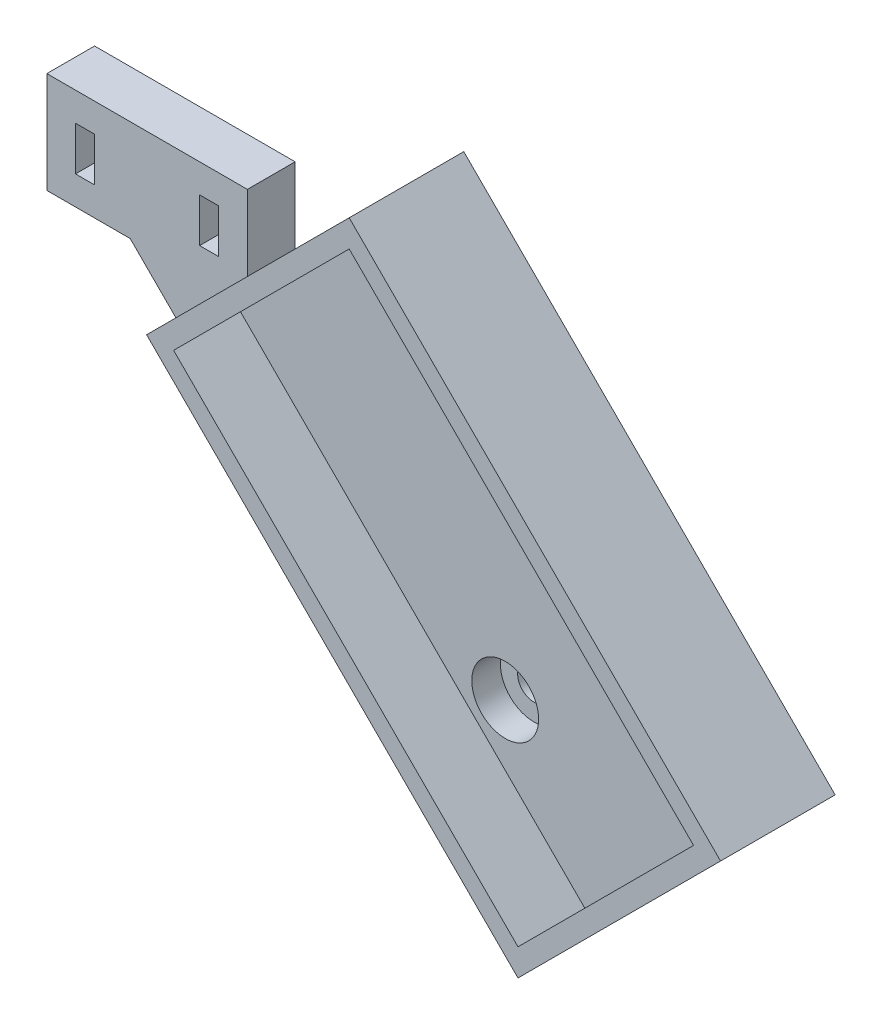
ISO-10303-21;
HEADER;
FILE_DESCRIPTION(('STEP AP214'),'2;1');
FILE_NAME('part.step','',(''),(''),'','','');
FILE_SCHEMA(('AUTOMOTIVE_DESIGN { 1 0 10303 214 1 1 1 1 }'));
ENDSEC;
DATA;
#1=APPLICATION_CONTEXT('core data for automotive mechanical design processes');
#2=APPLICATION_PROTOCOL_DEFINITION('international standard','automotive_design',2000,#1);
#3=PRODUCT_CONTEXT('',#1,'mechanical');
#4=PRODUCT('Part','Part','',(#3));
#5=PRODUCT_RELATED_PRODUCT_CATEGORY('part','',(#4));
#6=PRODUCT_DEFINITION_FORMATION('','',#4);
#7=PRODUCT_DEFINITION_CONTEXT('part definition',#1,'design');
#8=PRODUCT_DEFINITION('design','',#6,#7);
#9=PRODUCT_DEFINITION_SHAPE('','',#8);
#10=(LENGTH_UNIT() NAMED_UNIT(*) SI_UNIT(.MILLI.,.METRE.));
#11=(NAMED_UNIT(*) PLANE_ANGLE_UNIT() SI_UNIT($,.RADIAN.));
#12=(NAMED_UNIT(*) SI_UNIT($,.STERADIAN.) SOLID_ANGLE_UNIT());
#13=UNCERTAINTY_MEASURE_WITH_UNIT(LENGTH_MEASURE(1.E-05),#10,'distance_accuracy_value','');
#14=(GEOMETRIC_REPRESENTATION_CONTEXT(3) GLOBAL_UNCERTAINTY_ASSIGNED_CONTEXT((#13)) GLOBAL_UNIT_ASSIGNED_CONTEXT((#10,
#11,#12)) REPRESENTATION_CONTEXT('',''));
#15=CARTESIAN_POINT('',(0.,0.,0.));
#16=DIRECTION('',(0.,0.,1.));
#17=DIRECTION('',(1.,0.,0.));
#18=AXIS2_PLACEMENT_3D('',#15,#16,#17);
#19=CARTESIAN_POINT('',(-67.5,-52.5,102.));
#20=DIRECTION('',(0.,0.,1.));
#21=DIRECTION('',(-0.707106781186548,0.707106781186548,0.));
#22=AXIS2_PLACEMENT_3D('',#19,#20,#21);
#23=CYLINDRICAL_SURFACE('',#22,3.5);
#24=DIRECTION('',(0.,0.,1.));
#25=VECTOR('',#24,1.);
#26=CARTESIAN_POINT('',(-69.97487373415,-50.02512626584,102.));
#27=LINE('',#26,#25);
#28=CARTESIAN_POINT('',(-69.97487373415,-50.02512626584,102.));
#29=VERTEX_POINT('',#28);
#30=CARTESIAN_POINT('',(-69.97487373415,-50.02512626584,105.));
#31=VERTEX_POINT('',#30);
#32=EDGE_CURVE('E10',#29,#31,#27,.T.);
#33=ORIENTED_EDGE('',*,*,#32,.F.);
#34=CARTESIAN_POINT('',(-67.5,-52.5,102.));
#35=DIRECTION('',(0.,0.,1.));
#36=DIRECTION('',(-0.707106781186548,0.707106781186548,0.));
#37=AXIS2_PLACEMENT_3D('',#34,#35,#36);
#38=CIRCLE('',#37,3.5);
#39=EDGE_CURVE('E19',#29,#29,#38,.T.);
#40=ORIENTED_EDGE('',*,*,#39,.F.);
#41=ORIENTED_EDGE('',*,*,#32,.T.);
#42=CARTESIAN_POINT('',(-67.5,-52.5,105.));
#43=DIRECTION('',(0.,0.,1.));
#44=DIRECTION('',(-0.707106781186548,0.707106781186548,0.));
#45=AXIS2_PLACEMENT_3D('',#42,#43,#44);
#46=CIRCLE('',#45,3.5);
#47=EDGE_CURVE('E26',#31,#31,#46,.T.);
#48=ORIENTED_EDGE('',*,*,#47,.T.);
#49=EDGE_LOOP('',(#33,#40,#41,#48));
#50=FACE_BOUND('',#49,.T.);
#51=ADVANCED_FACE('F15',(#50),#23,.F.);
#52=CARTESIAN_POINT('',(-37.94796179957,-48.83883476483,105.));
#53=DIRECTION('',(0.,0.,1.));
#54=DIRECTION('',(1.,0.,0.));
#55=AXIS2_PLACEMENT_3D('',#52,#53,#54);
#56=PLANE('',#55);
#57=ORIENTED_EDGE('',*,*,#47,.F.);
#58=EDGE_LOOP('',(#57));
#59=FACE_BOUND('',#58,.T.);
#60=DIRECTION('',(0.707106781186548,-0.707106781186548,0.));
#61=VECTOR('',#60,1.);
#62=CARTESIAN_POINT('',(-40.06928214313,-49.54594154601,105.));
#63=LINE('',#62,#61);
#64=CARTESIAN_POINT('',(-76.83883476483,-12.77638892431,105.));
#65=VERTEX_POINT('',#64);
#66=CARTESIAN_POINT('',(-40.77638892431,-48.83883476483,105.));
#67=VERTEX_POINT('',#66);
#68=EDGE_CURVE('E369',#65,#67,#63,.T.);
#69=ORIENTED_EDGE('',*,*,#68,.F.);
#70=DIRECTION('',(-0.707106781186548,-0.707106781186548,0.));
#71=VECTOR('',#70,1.);
#72=CARTESIAN_POINT('',(-76.13172798364,-12.06928214313,105.));
#73=LINE('',#72,#71);
#74=CARTESIAN_POINT('',(-95.22361107568,-31.16116523516,105.));
#75=VERTEX_POINT('',#74);
#76=EDGE_CURVE('E359',#65,#75,#73,.T.);
#77=ORIENTED_EDGE('',*,*,#76,.T.);
#78=DIRECTION('',(0.707106781186548,-0.707106781186548,0.));
#79=VECTOR('',#78,1.);
#80=CARTESIAN_POINT('',(-58.45405845398,-67.93071785686,105.));
#81=LINE('',#80,#79);
#82=CARTESIAN_POINT('',(-59.16116523516,-67.22361107568,105.));
#83=VERTEX_POINT('',#82);
#84=EDGE_CURVE('E387',#75,#83,#81,.T.);
#85=ORIENTED_EDGE('',*,*,#84,.T.);
#86=DIRECTION('',(-0.707106781186548,-0.707106781186548,0.));
#87=VECTOR('',#86,1.);
#88=CARTESIAN_POINT('',(-40.06928214313,-48.13172798364,105.));
#89=LINE('',#88,#87);
#90=EDGE_CURVE('E382',#67,#83,#89,.T.);
#91=ORIENTED_EDGE('',*,*,#90,.F.);
#92=EDGE_LOOP('',(#69,#77,#85,#91));
#93=FACE_BOUND('',#92,.T.);
#94=ADVANCED_FACE('F510',(#59,#93),#56,.T.);
#95=CARTESIAN_POINT('',(-97.5,-27.3,99.9));
#96=DIRECTION('',(0.,-1.,0.));
#97=DIRECTION('',(0.,0.,-1.));
#98=AXIS2_PLACEMENT_3D('',#95,#96,#97);
#99=PLANE('',#98);
#100=DIRECTION('',(1.,0.,0.));
#101=VECTOR('',#100,1.);
#102=CARTESIAN_POINT('',(-96.,-27.3,105.));
#103=LINE('',#102,#101);
#104=CARTESIAN_POINT('',(-99.5,-27.3,105.));
#105=VERTEX_POINT('',#104);
#106=CARTESIAN_POINT('',(-97.5,-27.3,105.));
#107=VERTEX_POINT('',#106);
#108=EDGE_CURVE('E392',#105,#107,#103,.T.);
#109=ORIENTED_EDGE('',*,*,#108,.T.);
#110=DIRECTION('',(0.,0.,1.));
#111=VECTOR('',#110,1.);
#112=CARTESIAN_POINT('',(-97.5,-27.3,99.9));
#113=LINE('',#112,#111);
#114=CARTESIAN_POINT('',(-97.5,-27.3,100.));
#115=VERTEX_POINT('',#114);
#116=EDGE_CURVE('E280',#115,#107,#113,.T.);
#117=ORIENTED_EDGE('',*,*,#116,.F.);
#118=DIRECTION('',(1.,0.,0.));
#119=VECTOR('',#118,1.);
#120=CARTESIAN_POINT('',(-96.,-27.3,100.));
#121=LINE('',#120,#119);
#122=CARTESIAN_POINT('',(-99.5,-27.3,100.));
#123=VERTEX_POINT('',#122);
#124=EDGE_CURVE('E438',#123,#115,#121,.T.);
#125=ORIENTED_EDGE('',*,*,#124,.F.);
#126=DIRECTION('',(0.,0.,1.));
#127=VECTOR('',#126,1.);
#128=CARTESIAN_POINT('',(-99.5,-27.3,99.9));
#129=LINE('',#128,#127);
#130=EDGE_CURVE('E354',#123,#105,#129,.T.);
#131=ORIENTED_EDGE('',*,*,#130,.T.);
#132=EDGE_LOOP('',(#109,#117,#125,#131));
#133=FACE_BOUND('',#132,.T.);
#134=ADVANCED_FACE('F515',(#133),#99,.F.);
#135=CARTESIAN_POINT('',(-97.5,-22.7,99.9));
#136=DIRECTION('',(-1.,0.,0.));
#137=DIRECTION('',(0.,1.,0.));
#138=AXIS2_PLACEMENT_3D('',#135,#136,#137);
#139=PLANE('',#138);
#140=DIRECTION('',(0.,0.,1.));
#141=VECTOR('',#140,1.);
#142=CARTESIAN_POINT('',(-97.5,-22.7,99.9));
#143=LINE('',#142,#141);
#144=CARTESIAN_POINT('',(-97.5,-22.7,100.));
#145=VERTEX_POINT('',#144);
#146=CARTESIAN_POINT('',(-97.5,-22.7,105.));
#147=VERTEX_POINT('',#146);
#148=EDGE_CURVE('E262',#145,#147,#143,.T.);
#149=ORIENTED_EDGE('',*,*,#148,.F.);
#150=DIRECTION('',(0.,-1.,0.));
#151=VECTOR('',#150,1.);
#152=CARTESIAN_POINT('',(-97.5,-21.2,100.));
#153=LINE('',#152,#151);
#154=EDGE_CURVE('E277',#145,#115,#153,.T.);
#155=ORIENTED_EDGE('',*,*,#154,.T.);
#156=ORIENTED_EDGE('',*,*,#116,.T.);
#157=DIRECTION('',(0.,-1.,0.));
#158=VECTOR('',#157,1.);
#159=CARTESIAN_POINT('',(-97.5,-21.2,105.));
#160=LINE('',#159,#158);
#161=EDGE_CURVE('E402',#147,#107,#160,.T.);
#162=ORIENTED_EDGE('',*,*,#161,.F.);
#163=EDGE_LOOP('',(#149,#155,#156,#162));
#164=FACE_BOUND('',#163,.T.);
#165=ADVANCED_FACE('F627',(#164),#139,.T.);
#166=CARTESIAN_POINT('',(-99.5,-22.7,99.9));
#167=DIRECTION('',(-1.,0.,0.));
#168=DIRECTION('',(0.,1.,0.));
#169=AXIS2_PLACEMENT_3D('',#166,#167,#168);
#170=PLANE('',#169);
#171=DIRECTION('',(0.,-1.,0.));
#172=VECTOR('',#171,1.);
#173=CARTESIAN_POINT('',(-99.5,-21.2,105.));
#174=LINE('',#173,#172);
#175=CARTESIAN_POINT('',(-99.5,-22.7,105.));
#176=VERTEX_POINT('',#175);
#177=EDGE_CURVE('E388',#176,#105,#174,.T.);
#178=ORIENTED_EDGE('',*,*,#177,.T.);
#179=ORIENTED_EDGE('',*,*,#130,.F.);
#180=DIRECTION('',(0.,-1.,0.));
#181=VECTOR('',#180,1.);
#182=CARTESIAN_POINT('',(-99.5,-21.2,100.));
#183=LINE('',#182,#181);
#184=CARTESIAN_POINT('',(-99.5,-22.7,100.));
#185=VERTEX_POINT('',#184);
#186=EDGE_CURVE('E464',#185,#123,#183,.T.);
#187=ORIENTED_EDGE('',*,*,#186,.F.);
#188=DIRECTION('',(0.,0.,1.));
#189=VECTOR('',#188,1.);
#190=CARTESIAN_POINT('',(-99.5,-22.7,99.9));
#191=LINE('',#190,#189);
#192=EDGE_CURVE('E233',#185,#176,#191,.T.);
#193=ORIENTED_EDGE('',*,*,#192,.T.);
#194=EDGE_LOOP('',(#178,#179,#187,#193));
#195=FACE_BOUND('',#194,.T.);
#196=ADVANCED_FACE('F622',(#195),#170,.F.);
#197=CARTESIAN_POINT('',(-97.5,-22.7,99.9));
#198=DIRECTION('',(0.,-1.,0.));
#199=DIRECTION('',(0.,0.,-1.));
#200=AXIS2_PLACEMENT_3D('',#197,#198,#199);
#201=PLANE('',#200);
#202=ORIENTED_EDGE('',*,*,#192,.F.);
#203=DIRECTION('',(1.,0.,0.));
#204=VECTOR('',#203,1.);
#205=CARTESIAN_POINT('',(-96.,-22.7,100.));
#206=LINE('',#205,#204);
#207=EDGE_CURVE('E368',#185,#145,#206,.T.);
#208=ORIENTED_EDGE('',*,*,#207,.T.);
#209=ORIENTED_EDGE('',*,*,#148,.T.);
#210=DIRECTION('',(1.,0.,0.));
#211=VECTOR('',#210,1.);
#212=CARTESIAN_POINT('',(-96.,-22.7,105.));
#213=LINE('',#212,#211);
#214=EDGE_CURVE('E398',#176,#147,#213,.T.);
#215=ORIENTED_EDGE('',*,*,#214,.F.);
#216=EDGE_LOOP('',(#202,#208,#209,#215));
#217=FACE_BOUND('',#216,.T.);
#218=ADVANCED_FACE('F582',(#217),#201,.T.);
#219=CARTESIAN_POINT('',(-110.5,-27.3,99.9));
#220=DIRECTION('',(0.,-1.,0.));
#221=DIRECTION('',(0.,0.,-1.));
#222=AXIS2_PLACEMENT_3D('',#219,#220,#221);
#223=PLANE('',#222);
#224=DIRECTION('',(1.,0.,0.));
#225=VECTOR('',#224,1.);
#226=CARTESIAN_POINT('',(-102.5,-27.3,105.));
#227=LINE('',#226,#225);
#228=CARTESIAN_POINT('',(-112.5,-27.3,105.));
#229=VERTEX_POINT('',#228);
#230=CARTESIAN_POINT('',(-110.5,-27.3,105.));
#231=VERTEX_POINT('',#230);
#232=EDGE_CURVE('E237',#229,#231,#227,.T.);
#233=ORIENTED_EDGE('',*,*,#232,.T.);
#234=DIRECTION('',(0.,0.,1.));
#235=VECTOR('',#234,1.);
#236=CARTESIAN_POINT('',(-110.5,-27.3,99.9));
#237=LINE('',#236,#235);
#238=CARTESIAN_POINT('',(-110.5,-27.3,100.));
#239=VERTEX_POINT('',#238);
#240=EDGE_CURVE('E220',#239,#231,#237,.T.);
#241=ORIENTED_EDGE('',*,*,#240,.F.);
#242=DIRECTION('',(1.,0.,0.));
#243=VECTOR('',#242,1.);
#244=CARTESIAN_POINT('',(-102.5,-27.3,100.));
#245=LINE('',#244,#243);
#246=CARTESIAN_POINT('',(-112.5,-27.3,100.));
#247=VERTEX_POINT('',#246);
#248=EDGE_CURVE('E276',#247,#239,#245,.T.);
#249=ORIENTED_EDGE('',*,*,#248,.F.);
#250=DIRECTION('',(0.,0.,1.));
#251=VECTOR('',#250,1.);
#252=CARTESIAN_POINT('',(-112.5,-27.3,99.9));
#253=LINE('',#252,#251);
#254=EDGE_CURVE('E234',#247,#229,#253,.T.);
#255=ORIENTED_EDGE('',*,*,#254,.T.);
#256=EDGE_LOOP('',(#233,#241,#249,#255));
#257=FACE_BOUND('',#256,.T.);
#258=ADVANCED_FACE('F238',(#257),#223,.F.);
#259=CARTESIAN_POINT('',(-110.5,-22.7,99.9));
#260=DIRECTION('',(-1.,0.,0.));
#261=DIRECTION('',(0.,1.,0.));
#262=AXIS2_PLACEMENT_3D('',#259,#260,#261);
#263=PLANE('',#262);
#264=DIRECTION('',(0.,0.,1.));
#265=VECTOR('',#264,1.);
#266=CARTESIAN_POINT('',(-110.5,-22.7,99.9));
#267=LINE('',#266,#265);
#268=CARTESIAN_POINT('',(-110.5,-22.7,100.));
#269=VERTEX_POINT('',#268);
#270=CARTESIAN_POINT('',(-110.5,-22.7,105.));
#271=VERTEX_POINT('',#270);
#272=EDGE_CURVE('E270',#269,#271,#267,.T.);
#273=ORIENTED_EDGE('',*,*,#272,.F.);
#274=DIRECTION('',(0.,-1.,0.));
#275=VECTOR('',#274,1.);
#276=CARTESIAN_POINT('',(-110.5,-21.2,100.));
#277=LINE('',#276,#275);
#278=EDGE_CURVE('E228',#269,#239,#277,.T.);
#279=ORIENTED_EDGE('',*,*,#278,.T.);
#280=ORIENTED_EDGE('',*,*,#240,.T.);
#281=DIRECTION('',(0.,-1.,0.));
#282=VECTOR('',#281,1.);
#283=CARTESIAN_POINT('',(-110.5,-21.2,105.));
#284=LINE('',#283,#282);
#285=EDGE_CURVE('E225',#271,#231,#284,.T.);
#286=ORIENTED_EDGE('',*,*,#285,.F.);
#287=EDGE_LOOP('',(#273,#279,#280,#286));
#288=FACE_BOUND('',#287,.T.);
#289=ADVANCED_FACE('F223',(#288),#263,.T.);
#290=CARTESIAN_POINT('',(-112.5,-22.7,99.9));
#291=DIRECTION('',(-1.,0.,0.));
#292=DIRECTION('',(0.,1.,0.));
#293=AXIS2_PLACEMENT_3D('',#290,#291,#292);
#294=PLANE('',#293);
#295=DIRECTION('',(0.,-1.,0.));
#296=VECTOR('',#295,1.);
#297=CARTESIAN_POINT('',(-112.5,-21.2,105.));
#298=LINE('',#297,#296);
#299=CARTESIAN_POINT('',(-112.5,-22.7,105.));
#300=VERTEX_POINT('',#299);
#301=EDGE_CURVE('E243',#300,#229,#298,.T.);
#302=ORIENTED_EDGE('',*,*,#301,.T.);
#303=ORIENTED_EDGE('',*,*,#254,.F.);
#304=DIRECTION('',(0.,-1.,0.));
#305=VECTOR('',#304,1.);
#306=CARTESIAN_POINT('',(-112.5,-21.2,100.));
#307=LINE('',#306,#305);
#308=CARTESIAN_POINT('',(-112.5,-22.7,100.));
#309=VERTEX_POINT('',#308);
#310=EDGE_CURVE('E272',#309,#247,#307,.T.);
#311=ORIENTED_EDGE('',*,*,#310,.F.);
#312=DIRECTION('',(0.,0.,1.));
#313=VECTOR('',#312,1.);
#314=CARTESIAN_POINT('',(-112.5,-22.7,99.9));
#315=LINE('',#314,#313);
#316=EDGE_CURVE('E286',#309,#300,#315,.T.);
#317=ORIENTED_EDGE('',*,*,#316,.T.);
#318=EDGE_LOOP('',(#302,#303,#311,#317));
#319=FACE_BOUND('',#318,.T.);
#320=ADVANCED_FACE('F520',(#319),#294,.F.);
#321=CARTESIAN_POINT('',(-110.5,-22.7,99.9));
#322=DIRECTION('',(0.,-1.,0.));
#323=DIRECTION('',(0.,0.,-1.));
#324=AXIS2_PLACEMENT_3D('',#321,#322,#323);
#325=PLANE('',#324);
#326=ORIENTED_EDGE('',*,*,#316,.F.);
#327=DIRECTION('',(1.,0.,0.));
#328=VECTOR('',#327,1.);
#329=CARTESIAN_POINT('',(-102.5,-22.7,100.));
#330=LINE('',#329,#328);
#331=EDGE_CURVE('E268',#309,#269,#330,.T.);
#332=ORIENTED_EDGE('',*,*,#331,.T.);
#333=ORIENTED_EDGE('',*,*,#272,.T.);
#334=DIRECTION('',(1.,0.,0.));
#335=VECTOR('',#334,1.);
#336=CARTESIAN_POINT('',(-102.5,-22.7,105.));
#337=LINE('',#336,#335);
#338=EDGE_CURVE('E247',#300,#271,#337,.T.);
#339=ORIENTED_EDGE('',*,*,#338,.F.);
#340=EDGE_LOOP('',(#326,#332,#333,#339));
#341=FACE_BOUND('',#340,.T.);
#342=ADVANCED_FACE('F522',(#341),#325,.T.);
#343=CARTESIAN_POINT('',(-94.5,-19.7,100.));
#344=DIRECTION('',(0.,-1.,0.));
#345=DIRECTION('',(0.,0.,-1.));
#346=AXIS2_PLACEMENT_3D('',#343,#344,#345);
#347=PLANE('',#346);
#348=DIRECTION('',(0.,0.,1.));
#349=VECTOR('',#348,1.);
#350=CARTESIAN_POINT('',(-115.5,-19.7,100.));
#351=LINE('',#350,#349);
#352=CARTESIAN_POINT('',(-115.5,-19.7,100.));
#353=VERTEX_POINT('',#352);
#354=CARTESIAN_POINT('',(-115.5,-19.7,105.));
#355=VERTEX_POINT('',#354);
#356=EDGE_CURVE('E289',#353,#355,#351,.T.);
#357=ORIENTED_EDGE('',*,*,#356,.T.);
#358=DIRECTION('',(-1.,0.,0.));
#359=VECTOR('',#358,1.);
#360=CARTESIAN_POINT('',(-94.5,-19.7,105.));
#361=LINE('',#360,#359);
#362=CARTESIAN_POINT('',(-94.5,-19.7,105.));
#363=VERTEX_POINT('',#362);
#364=EDGE_CURVE('E299',#363,#355,#361,.T.);
#365=ORIENTED_EDGE('',*,*,#364,.F.);
#366=DIRECTION('',(0.,0.,1.));
#367=VECTOR('',#366,1.);
#368=CARTESIAN_POINT('',(-94.5,-19.7,100.));
#369=LINE('',#368,#367);
#370=CARTESIAN_POINT('',(-94.5,-19.7,100.));
#371=VERTEX_POINT('',#370);
#372=EDGE_CURVE('E386',#371,#363,#369,.T.);
#373=ORIENTED_EDGE('',*,*,#372,.F.);
#374=DIRECTION('',(-1.,0.,0.));
#375=VECTOR('',#374,1.);
#376=CARTESIAN_POINT('',(-94.5,-19.7,100.));
#377=LINE('',#376,#375);
#378=EDGE_CURVE('E295',#371,#353,#377,.T.);
#379=ORIENTED_EDGE('',*,*,#378,.T.);
#380=EDGE_LOOP('',(#357,#365,#373,#379));
#381=FACE_BOUND('',#380,.T.);
#382=ADVANCED_FACE('F698',(#381),#347,.F.);
#383=CARTESIAN_POINT('',(-115.5,-19.7,100.));
#384=DIRECTION('',(-1.,0.,0.));
#385=DIRECTION('',(0.,1.,0.));
#386=AXIS2_PLACEMENT_3D('',#383,#384,#385);
#387=PLANE('',#386);
#388=ORIENTED_EDGE('',*,*,#356,.F.);
#389=DIRECTION('',(0.,-1.,0.));
#390=VECTOR('',#389,1.);
#391=CARTESIAN_POINT('',(-115.5,-19.7,100.));
#392=LINE('',#391,#390);
#393=CARTESIAN_POINT('',(-115.5,-30.3,100.));
#394=VERTEX_POINT('',#393);
#395=EDGE_CURVE('E313',#353,#394,#392,.T.);
#396=ORIENTED_EDGE('',*,*,#395,.T.);
#397=DIRECTION('',(0.,0.,1.));
#398=VECTOR('',#397,1.);
#399=CARTESIAN_POINT('',(-115.5,-30.3,100.));
#400=LINE('',#399,#398);
#401=CARTESIAN_POINT('',(-115.5,-30.3,105.));
#402=VERTEX_POINT('',#401);
#403=EDGE_CURVE('E431',#394,#402,#400,.T.);
#404=ORIENTED_EDGE('',*,*,#403,.T.);
#405=DIRECTION('',(0.,-1.,0.));
#406=VECTOR('',#405,1.);
#407=CARTESIAN_POINT('',(-115.5,-19.7,105.));
#408=LINE('',#407,#406);
#409=EDGE_CURVE('E285',#355,#402,#408,.T.);
#410=ORIENTED_EDGE('',*,*,#409,.F.);
#411=EDGE_LOOP('',(#388,#396,#404,#410));
#412=FACE_BOUND('',#411,.T.);
#413=ADVANCED_FACE('F529',(#412),#387,.T.);
#414=CARTESIAN_POINT('',(-94.5,-30.3,100.));
#415=DIRECTION('',(0.,-1.,0.));
#416=DIRECTION('',(0.,0.,-1.));
#417=AXIS2_PLACEMENT_3D('',#414,#415,#416);
#418=PLANE('',#417);
#419=DIRECTION('',(-1.,0.,0.));
#420=VECTOR('',#419,1.);
#421=CARTESIAN_POINT('',(-94.5,-30.3,100.));
#422=LINE('',#421,#420);
#423=CARTESIAN_POINT('',(-106.7710678118,-30.3,100.));
#424=VERTEX_POINT('',#423);
#425=EDGE_CURVE('E445',#424,#394,#422,.T.);
#426=ORIENTED_EDGE('',*,*,#425,.F.);
#427=DIRECTION('',(0.,0.,-1.));
#428=VECTOR('',#427,1.);
#429=CARTESIAN_POINT('',(-106.7710678118,-30.3,100.));
#430=LINE('',#429,#428);
#431=CARTESIAN_POINT('',(-106.7710678118,-30.3,105.));
#432=VERTEX_POINT('',#431);
#433=EDGE_CURVE('E434',#432,#424,#430,.T.);
#434=ORIENTED_EDGE('',*,*,#433,.F.);
#435=DIRECTION('',(-1.,0.,0.));
#436=VECTOR('',#435,1.);
#437=CARTESIAN_POINT('',(-94.5,-30.3,105.));
#438=LINE('',#437,#436);
#439=EDGE_CURVE('E281',#432,#402,#438,.T.);
#440=ORIENTED_EDGE('',*,*,#439,.T.);
#441=ORIENTED_EDGE('',*,*,#403,.F.);
#442=EDGE_LOOP('',(#426,#434,#440,#441));
#443=FACE_BOUND('',#442,.T.);
#444=ADVANCED_FACE('F525',(#443),#418,.T.);
#445=CARTESIAN_POINT('',(-101.2738636073,-35.79720420448,100.));
#446=DIRECTION('',(-0.707106781186548,-0.707106781186548,0.));
#447=DIRECTION('',(-0.707106781186548,0.707106781186548,0.));
#448=AXIS2_PLACEMENT_3D('',#445,#446,#447);
#449=PLANE('',#448);
#450=DIRECTION('',(-0.707106781186548,0.707106781186548,0.));
#451=VECTOR('',#450,1.);
#452=CARTESIAN_POINT('',(-101.2738636073,-35.79720420448,100.));
#453=LINE('',#452,#451);
#454=CARTESIAN_POINT('',(-101.2738636073,-35.79720420448,100.));
#455=VERTEX_POINT('',#454);
#456=EDGE_CURVE('E358',#455,#424,#453,.T.);
#457=ORIENTED_EDGE('',*,*,#456,.F.);
#458=DIRECTION('',(0.,0.,1.));
#459=VECTOR('',#458,1.);
#460=CARTESIAN_POINT('',(-101.2738636073,-35.79720420448,100.));
#461=LINE('',#460,#459);
#462=CARTESIAN_POINT('',(-101.2738636073,-35.79720420448,105.));
#463=VERTEX_POINT('',#462);
#464=EDGE_CURVE('E349',#455,#463,#461,.T.);
#465=ORIENTED_EDGE('',*,*,#464,.T.);
#466=DIRECTION('',(-0.707106781186548,0.707106781186548,0.));
#467=VECTOR('',#466,1.);
#468=CARTESIAN_POINT('',(-101.2738636073,-35.79720420448,105.));
#469=LINE('',#468,#467);
#470=EDGE_CURVE('E254',#463,#432,#469,.T.);
#471=ORIENTED_EDGE('',*,*,#470,.T.);
#472=ORIENTED_EDGE('',*,*,#433,.T.);
#473=EDGE_LOOP('',(#457,#465,#471,#472));
#474=FACE_BOUND('',#473,.T.);
#475=ADVANCED_FACE('F528',(#474),#449,.T.);
#476=CARTESIAN_POINT('',(-67.5,-52.5,102.));
#477=DIRECTION('',(0.,0.,1.));
#478=DIRECTION('',(1.,0.,0.));
#479=AXIS2_PLACEMENT_3D('',#476,#477,#478);
#480=PLANE('',#479);
#481=CARTESIAN_POINT('',(-67.5,-52.5,102.));
#482=DIRECTION('',(0.,0.,1.));
#483=DIRECTION('',(-0.707106781186548,0.707106781186548,0.));
#484=AXIS2_PLACEMENT_3D('',#481,#482,#483);
#485=CIRCLE('',#484,1.7);
#486=CARTESIAN_POINT('',(-68.70208152801,-51.29791847198,102.));
#487=VERTEX_POINT('',#486);
#488=EDGE_CURVE('E347',#487,#487,#485,.T.);
#489=ORIENTED_EDGE('',*,*,#488,.F.);
#490=EDGE_LOOP('',(#489));
#491=FACE_BOUND('',#490,.T.);
#492=ORIENTED_EDGE('',*,*,#39,.T.);
#493=EDGE_LOOP('',(#492));
#494=FACE_BOUND('',#493,.T.);
#495=ADVANCED_FACE('F504',(#491,#494),#480,.T.);
#496=CARTESIAN_POINT('',(-94.5,-19.7,100.));
#497=DIRECTION('',(-1.,0.,0.));
#498=DIRECTION('',(0.,1.,0.));
#499=AXIS2_PLACEMENT_3D('',#496,#497,#498);
#500=PLANE('',#499);
#501=DIRECTION('',(0.,0.,1.));
#502=VECTOR('',#501,1.);
#503=CARTESIAN_POINT('',(-94.5,-27.60912703474,100.));
#504=LINE('',#503,#502);
#505=CARTESIAN_POINT('',(-94.5,-27.60912703474,100.));
#506=VERTEX_POINT('',#505);
#507=CARTESIAN_POINT('',(-94.5,-27.60912703474,105.));
#508=VERTEX_POINT('',#507);
#509=EDGE_CURVE('E342',#506,#508,#504,.T.);
#510=ORIENTED_EDGE('',*,*,#509,.F.);
#511=DIRECTION('',(0.,-1.,0.));
#512=VECTOR('',#511,1.);
#513=CARTESIAN_POINT('',(-94.5,-19.7,100.));
#514=LINE('',#513,#512);
#515=EDGE_CURVE('E290',#371,#506,#514,.T.);
#516=ORIENTED_EDGE('',*,*,#515,.F.);
#517=ORIENTED_EDGE('',*,*,#372,.T.);
#518=DIRECTION('',(0.,-1.,0.));
#519=VECTOR('',#518,1.);
#520=CARTESIAN_POINT('',(-94.5,-19.7,105.));
#521=LINE('',#520,#519);
#522=EDGE_CURVE('E296',#363,#508,#521,.T.);
#523=ORIENTED_EDGE('',*,*,#522,.T.);
#524=EDGE_LOOP('',(#510,#516,#517,#523));
#525=FACE_BOUND('',#524,.T.);
#526=ADVANCED_FACE('F494',(#525),#500,.F.);
#527=CARTESIAN_POINT('',(-40.77638892431,-48.83883476483,104.9));
#528=DIRECTION('',(-0.707106781186548,0.707106781186548,0.));
#529=DIRECTION('',(0.,0.,1.));
#530=AXIS2_PLACEMENT_3D('',#527,#528,#529);
#531=PLANE('',#530);
#532=DIRECTION('',(0.,0.,1.));
#533=VECTOR('',#532,1.);
#534=CARTESIAN_POINT('',(-40.77638892431,-48.83883476483,104.9));
#535=LINE('',#534,#533);
#536=CARTESIAN_POINT('',(-40.77638892431,-48.83883476483,112.));
#537=VERTEX_POINT('',#536);
#538=EDGE_CURVE('E373',#67,#537,#535,.T.);
#539=ORIENTED_EDGE('',*,*,#538,.F.);
#540=ORIENTED_EDGE('',*,*,#90,.T.);
#541=DIRECTION('',(0.,0.,1.));
#542=VECTOR('',#541,1.);
#543=CARTESIAN_POINT('',(-59.16116523516,-67.22361107568,104.9));
#544=LINE('',#543,#542);
#545=CARTESIAN_POINT('',(-59.16116523516,-67.22361107568,112.));
#546=VERTEX_POINT('',#545);
#547=EDGE_CURVE('E363',#83,#546,#544,.T.);
#548=ORIENTED_EDGE('',*,*,#547,.T.);
#549=DIRECTION('',(-0.707106781186548,-0.707106781186548,0.));
#550=VECTOR('',#549,1.);
#551=CARTESIAN_POINT('',(-40.06928214313,-48.13172798364,112.));
#552=LINE('',#551,#550);
#553=EDGE_CURVE('E326',#537,#546,#552,.T.);
#554=ORIENTED_EDGE('',*,*,#553,.F.);
#555=EDGE_LOOP('',(#539,#540,#548,#554));
#556=FACE_BOUND('',#555,.T.);
#557=ADVANCED_FACE('F491',(#556),#531,.T.);
#558=CARTESIAN_POINT('',(-59.16116523516,-67.22361107568,104.9));
#559=DIRECTION('',(-0.707106781186548,-0.707106781186548,0.));
#560=DIRECTION('',(-0.707106781186548,0.707106781186548,0.));
#561=AXIS2_PLACEMENT_3D('',#558,#559,#560);
#562=PLANE('',#561);
#563=DIRECTION('',(0.707106781186548,-0.707106781186548,0.));
#564=VECTOR('',#563,1.);
#565=CARTESIAN_POINT('',(-58.45405845398,-67.93071785686,112.));
#566=LINE('',#565,#564);
#567=CARTESIAN_POINT('',(-95.22361107568,-31.16116523516,112.));
#568=VERTEX_POINT('',#567);
#569=EDGE_CURVE('E321',#568,#546,#566,.T.);
#570=ORIENTED_EDGE('',*,*,#569,.T.);
#571=ORIENTED_EDGE('',*,*,#547,.F.);
#572=ORIENTED_EDGE('',*,*,#84,.F.);
#573=DIRECTION('',(0.,0.,1.));
#574=VECTOR('',#573,1.);
#575=CARTESIAN_POINT('',(-95.22361107568,-31.16116523516,104.9));
#576=LINE('',#575,#574);
#577=EDGE_CURVE('E364',#75,#568,#576,.T.);
#578=ORIENTED_EDGE('',*,*,#577,.T.);
#579=EDGE_LOOP('',(#570,#571,#572,#578));
#580=FACE_BOUND('',#579,.T.);
#581=ADVANCED_FACE('F493',(#580),#562,.F.);
#582=CARTESIAN_POINT('',(-76.83883476483,-12.77638892431,104.9));
#583=DIRECTION('',(-0.707106781186548,0.707106781186548,0.));
#584=DIRECTION('',(0.,0.,1.));
#585=AXIS2_PLACEMENT_3D('',#582,#583,#584);
#586=PLANE('',#585);
#587=DIRECTION('',(-0.707106781186548,-0.707106781186548,0.));
#588=VECTOR('',#587,1.);
#589=CARTESIAN_POINT('',(-76.13172798364,-12.06928214313,112.));
#590=LINE('',#589,#588);
#591=CARTESIAN_POINT('',(-76.83883476483,-12.77638892431,112.));
#592=VERTEX_POINT('',#591);
#593=EDGE_CURVE('E325',#592,#568,#590,.T.);
#594=ORIENTED_EDGE('',*,*,#593,.T.);
#595=ORIENTED_EDGE('',*,*,#577,.F.);
#596=ORIENTED_EDGE('',*,*,#76,.F.);
#597=DIRECTION('',(0.,0.,1.));
#598=VECTOR('',#597,1.);
#599=CARTESIAN_POINT('',(-76.83883476483,-12.77638892431,104.9));
#600=LINE('',#599,#598);
#601=EDGE_CURVE('E170',#65,#592,#600,.T.);
#602=ORIENTED_EDGE('',*,*,#601,.T.);
#603=EDGE_LOOP('',(#594,#595,#596,#602));
#604=FACE_BOUND('',#603,.T.);
#605=ADVANCED_FACE('F501',(#604),#586,.F.);
#606=CARTESIAN_POINT('',(-40.77638892431,-48.83883476483,104.9));
#607=DIRECTION('',(-0.707106781186548,-0.707106781186548,0.));
#608=DIRECTION('',(-0.707106781186548,0.707106781186548,0.));
#609=AXIS2_PLACEMENT_3D('',#606,#607,#608);
#610=PLANE('',#609);
#611=ORIENTED_EDGE('',*,*,#601,.F.);
#612=ORIENTED_EDGE('',*,*,#68,.T.);
#613=ORIENTED_EDGE('',*,*,#538,.T.);
#614=DIRECTION('',(0.707106781186548,-0.707106781186548,0.));
#615=VECTOR('',#614,1.);
#616=CARTESIAN_POINT('',(-40.06928214313,-49.54594154601,112.));
#617=LINE('',#616,#615);
#618=EDGE_CURVE('E258',#592,#537,#617,.T.);
#619=ORIENTED_EDGE('',*,*,#618,.F.);
#620=EDGE_LOOP('',(#611,#612,#613,#619));
#621=FACE_BOUND('',#620,.T.);
#622=ADVANCED_FACE('F486',(#621),#610,.T.);
#623=CARTESIAN_POINT('',(-94.5,-19.7,105.));
#624=DIRECTION('',(0.,0.,1.));
#625=DIRECTION('',(1.,0.,0.));
#626=AXIS2_PLACEMENT_3D('',#623,#624,#625);
#627=PLANE('',#626);
#628=ORIENTED_EDGE('',*,*,#214,.T.);
#629=ORIENTED_EDGE('',*,*,#161,.T.);
#630=ORIENTED_EDGE('',*,*,#108,.F.);
#631=ORIENTED_EDGE('',*,*,#177,.F.);
#632=EDGE_LOOP('',(#628,#629,#630,#631));
#633=FACE_BOUND('',#632,.T.);
#634=ORIENTED_EDGE('',*,*,#338,.T.);
#635=ORIENTED_EDGE('',*,*,#285,.T.);
#636=ORIENTED_EDGE('',*,*,#232,.F.);
#637=ORIENTED_EDGE('',*,*,#301,.F.);
#638=EDGE_LOOP('',(#634,#635,#636,#637));
#639=FACE_BOUND('',#638,.T.);
#640=ORIENTED_EDGE('',*,*,#522,.F.);
#641=ORIENTED_EDGE('',*,*,#364,.T.);
#642=ORIENTED_EDGE('',*,*,#409,.T.);
#643=ORIENTED_EDGE('',*,*,#439,.F.);
#644=ORIENTED_EDGE('',*,*,#470,.F.);
#645=DIRECTION('',(-0.707106781186548,-0.707106781186548,0.));
#646=VECTOR('',#645,1.);
#647=CARTESIAN_POINT('',(-94.20279579551,-28.72613639262,105.));
#648=LINE('',#647,#646);
#649=CARTESIAN_POINT('',(-97.34493141924,-31.86827201635,105.));
#650=VERTEX_POINT('',#649);
#651=EDGE_CURVE('E183',#650,#463,#648,.T.);
#652=ORIENTED_EDGE('',*,*,#651,.F.);
#653=DIRECTION('',(-0.707106781186548,0.707106781186548,0.));
#654=VECTOR('',#653,1.);
#655=CARTESIAN_POINT('',(-80.58388347648,-48.62931995911,105.));
#656=LINE('',#655,#654);
#657=CARTESIAN_POINT('',(-98.05203820042,-31.16116523516,105.));
#658=VERTEX_POINT('',#657);
#659=EDGE_CURVE('E338',#650,#658,#656,.T.);
#660=ORIENTED_EDGE('',*,*,#659,.T.);
#661=DIRECTION('',(0.707106781186548,0.707106781186548,0.));
#662=VECTOR('',#661,1.);
#663=CARTESIAN_POINT('',(-83.69213562373,-16.80126265847,105.));
#664=LINE('',#663,#662);
#665=EDGE_CURVE('E346',#658,#508,#664,.T.);
#666=ORIENTED_EDGE('',*,*,#665,.T.);
#667=EDGE_LOOP('',(#640,#641,#642,#643,#644,#652,#660,#666));
#668=FACE_BOUND('',#667,.T.);
#669=ADVANCED_FACE('F245',(#633,#639,#668),#627,.T.);
#670=CARTESIAN_POINT('',(-94.20279579551,-28.72613639262,100.));
#671=DIRECTION('',(-0.707106781186548,0.707106781186548,0.));
#672=DIRECTION('',(0.,0.,1.));
#673=AXIS2_PLACEMENT_3D('',#670,#671,#672);
#674=PLANE('',#673);
#675=ORIENTED_EDGE('',*,*,#464,.F.);
#676=DIRECTION('',(-0.707106781186548,-0.707106781186548,0.));
#677=VECTOR('',#676,1.);
#678=CARTESIAN_POINT('',(-94.20279579551,-28.72613639262,100.));
#679=LINE('',#678,#677);
#680=CARTESIAN_POINT('',(-97.34493141924,-31.86827201635,100.));
#681=VERTEX_POINT('',#680);
#682=EDGE_CURVE('E304',#681,#455,#679,.T.);
#683=ORIENTED_EDGE('',*,*,#682,.F.);
#684=DIRECTION('',(0.,0.,-1.));
#685=VECTOR('',#684,1.);
#686=CARTESIAN_POINT('',(-97.34493141924,-31.86827201635,100.));
#687=LINE('',#686,#685);
#688=EDGE_CURVE('E341',#650,#681,#687,.T.);
#689=ORIENTED_EDGE('',*,*,#688,.F.);
#690=ORIENTED_EDGE('',*,*,#651,.T.);
#691=EDGE_LOOP('',(#675,#683,#689,#690));
#692=FACE_BOUND('',#691,.T.);
#693=ADVANCED_FACE('F17',(#692),#674,.F.);
#694=CARTESIAN_POINT('',(-67.5,-52.5,99.9));
#695=DIRECTION('',(0.,0.,1.));
#696=DIRECTION('',(-0.707106781186548,0.707106781186548,0.));
#697=AXIS2_PLACEMENT_3D('',#694,#695,#696);
#698=CYLINDRICAL_SURFACE('',#697,1.7);
#699=DIRECTION('',(0.,0.,1.));
#700=VECTOR('',#699,1.);
#701=CARTESIAN_POINT('',(-68.70208152801,-51.29791847198,99.9));
#702=LINE('',#701,#700);
#703=CARTESIAN_POINT('',(-68.70208152801,-51.29791847198,100.));
#704=VERTEX_POINT('',#703);
#705=EDGE_CURVE('E350',#704,#487,#702,.T.);
#706=ORIENTED_EDGE('',*,*,#705,.F.);
#707=CARTESIAN_POINT('',(-67.5,-52.5,100.));
#708=DIRECTION('',(0.,0.,1.));
#709=DIRECTION('',(-0.707106781186548,0.707106781186548,0.));
#710=AXIS2_PLACEMENT_3D('',#707,#708,#709);
#711=CIRCLE('',#710,1.7);
#712=EDGE_CURVE('E337',#704,#704,#711,.T.);
#713=ORIENTED_EDGE('',*,*,#712,.F.);
#714=ORIENTED_EDGE('',*,*,#705,.T.);
#715=ORIENTED_EDGE('',*,*,#488,.T.);
#716=EDGE_LOOP('',(#706,#713,#714,#715));
#717=FACE_BOUND('',#716,.T.);
#718=ADVANCED_FACE('F558',(#717),#698,.F.);
#719=CARTESIAN_POINT('',(-76.83883476483,-9.947961799572,100.));
#720=DIRECTION('',(-0.707106781186548,0.707106781186548,0.));
#721=DIRECTION('',(0.,0.,1.));
#722=AXIS2_PLACEMENT_3D('',#719,#720,#721);
#723=PLANE('',#722);
#724=DIRECTION('',(0.,0.,1.));
#725=VECTOR('',#724,1.);
#726=CARTESIAN_POINT('',(-76.83883476483,-9.947961799572,100.));
#727=LINE('',#726,#725);
#728=CARTESIAN_POINT('',(-76.83883476483,-9.947961799572,100.));
#729=VERTEX_POINT('',#728);
#730=CARTESIAN_POINT('',(-76.83883476483,-9.947961799572,112.));
#731=VERTEX_POINT('',#730);
#732=EDGE_CURVE('E309',#729,#731,#727,.T.);
#733=ORIENTED_EDGE('',*,*,#732,.F.);
#734=DIRECTION('',(-0.707106781186548,-0.707106781186548,0.));
#735=VECTOR('',#734,1.);
#736=CARTESIAN_POINT('',(-76.83883476483,-9.947961799572,100.));
#737=LINE('',#736,#735);
#738=EDGE_CURVE('E294',#729,#506,#737,.T.);
#739=ORIENTED_EDGE('',*,*,#738,.T.);
#740=ORIENTED_EDGE('',*,*,#509,.T.);
#741=ORIENTED_EDGE('',*,*,#665,.F.);
#742=DIRECTION('',(0.,0.,-1.));
#743=VECTOR('',#742,1.);
#744=CARTESIAN_POINT('',(-98.05203820042,-31.16116523516,112.));
#745=LINE('',#744,#743);
#746=CARTESIAN_POINT('',(-98.05203820042,-31.16116523516,112.));
#747=VERTEX_POINT('',#746);
#748=EDGE_CURVE('E267',#747,#658,#745,.T.);
#749=ORIENTED_EDGE('',*,*,#748,.F.);
#750=DIRECTION('',(-0.707106781186548,-0.707106781186548,0.));
#751=VECTOR('',#750,1.);
#752=CARTESIAN_POINT('',(-76.83883476483,-9.947961799572,112.));
#753=LINE('',#752,#751);
#754=EDGE_CURVE('E454',#731,#747,#753,.T.);
#755=ORIENTED_EDGE('',*,*,#754,.F.);
#756=EDGE_LOOP('',(#733,#739,#740,#741,#749,#755));
#757=FACE_BOUND('',#756,.T.);
#758=ADVANCED_FACE('F552',(#757),#723,.T.);
#759=CARTESIAN_POINT('',(-37.94796179957,-48.83883476483,112.));
#760=DIRECTION('',(0.,0.,1.));
#761=DIRECTION('',(1.,0.,0.));
#762=AXIS2_PLACEMENT_3D('',#759,#760,#761);
#763=PLANE('',#762);
#764=ORIENTED_EDGE('',*,*,#618,.T.);
#765=ORIENTED_EDGE('',*,*,#553,.T.);
#766=ORIENTED_EDGE('',*,*,#569,.F.);
#767=ORIENTED_EDGE('',*,*,#593,.F.);
#768=EDGE_LOOP('',(#764,#765,#766,#767));
#769=FACE_BOUND('',#768,.T.);
#770=DIRECTION('',(-0.707106781186548,-0.707106781186548,0.));
#771=VECTOR('',#770,1.);
#772=CARTESIAN_POINT('',(-37.94796179957,-48.83883476483,112.));
#773=LINE('',#772,#771);
#774=CARTESIAN_POINT('',(-37.94796179957,-48.83883476483,112.));
#775=VERTEX_POINT('',#774);
#776=CARTESIAN_POINT('',(-59.16116523516,-70.05203820042,112.));
#777=VERTEX_POINT('',#776);
#778=EDGE_CURVE('E403',#775,#777,#773,.T.);
#779=ORIENTED_EDGE('',*,*,#778,.F.);
#780=DIRECTION('',(-0.707106781186548,0.707106781186548,0.));
#781=VECTOR('',#780,1.);
#782=CARTESIAN_POINT('',(-37.94796179957,-48.83883476483,112.));
#783=LINE('',#782,#781);
#784=EDGE_CURVE('E305',#775,#731,#783,.T.);
#785=ORIENTED_EDGE('',*,*,#784,.T.);
#786=ORIENTED_EDGE('',*,*,#754,.T.);
#787=DIRECTION('',(-0.707106781186548,0.707106781186548,0.));
#788=VECTOR('',#787,1.);
#789=CARTESIAN_POINT('',(-59.16116523516,-70.05203820042,112.));
#790=LINE('',#789,#788);
#791=EDGE_CURVE('E263',#777,#747,#790,.T.);
#792=ORIENTED_EDGE('',*,*,#791,.F.);
#793=EDGE_LOOP('',(#779,#785,#786,#792));
#794=FACE_BOUND('',#793,.T.);
#795=ADVANCED_FACE('F483',(#769,#794),#763,.T.);
#796=CARTESIAN_POINT('',(-59.16116523516,-70.05203820042,100.));
#797=DIRECTION('',(-0.707106781186548,-0.707106781186548,0.));
#798=DIRECTION('',(-0.707106781186548,0.707106781186548,0.));
#799=AXIS2_PLACEMENT_3D('',#796,#797,#798);
#800=PLANE('',#799);
#801=DIRECTION('',(-0.707106781186548,0.707106781186548,0.));
#802=VECTOR('',#801,1.);
#803=CARTESIAN_POINT('',(-59.16116523516,-70.05203820042,100.));
#804=LINE('',#803,#802);
#805=CARTESIAN_POINT('',(-59.16116523516,-70.05203820042,100.));
#806=VERTEX_POINT('',#805);
#807=EDGE_CURVE('E333',#806,#681,#804,.T.);
#808=ORIENTED_EDGE('',*,*,#807,.F.);
#809=DIRECTION('',(0.,0.,-1.));
#810=VECTOR('',#809,1.);
#811=CARTESIAN_POINT('',(-59.16116523516,-70.05203820042,112.));
#812=LINE('',#811,#810);
#813=EDGE_CURVE('E332',#777,#806,#812,.T.);
#814=ORIENTED_EDGE('',*,*,#813,.F.);
#815=ORIENTED_EDGE('',*,*,#791,.T.);
#816=ORIENTED_EDGE('',*,*,#748,.T.);
#817=ORIENTED_EDGE('',*,*,#659,.F.);
#818=ORIENTED_EDGE('',*,*,#688,.T.);
#819=EDGE_LOOP('',(#808,#814,#815,#816,#817,#818));
#820=FACE_BOUND('',#819,.T.);
#821=ADVANCED_FACE('F531',(#820),#800,.T.);
#822=CARTESIAN_POINT('',(-37.94796179957,-48.83883476483,100.));
#823=DIRECTION('',(0.,0.,1.));
#824=DIRECTION('',(1.,0.,0.));
#825=AXIS2_PLACEMENT_3D('',#822,#823,#824);
#826=PLANE('',#825);
#827=ORIENTED_EDGE('',*,*,#310,.T.);
#828=ORIENTED_EDGE('',*,*,#248,.T.);
#829=ORIENTED_EDGE('',*,*,#278,.F.);
#830=ORIENTED_EDGE('',*,*,#331,.F.);
#831=EDGE_LOOP('',(#827,#828,#829,#830));
#832=FACE_BOUND('',#831,.T.);
#833=ORIENTED_EDGE('',*,*,#207,.F.);
#834=ORIENTED_EDGE('',*,*,#186,.T.);
#835=ORIENTED_EDGE('',*,*,#124,.T.);
#836=ORIENTED_EDGE('',*,*,#154,.F.);
#837=EDGE_LOOP('',(#833,#834,#835,#836));
#838=FACE_BOUND('',#837,.T.);
#839=ORIENTED_EDGE('',*,*,#712,.T.);
#840=EDGE_LOOP('',(#839));
#841=FACE_BOUND('',#840,.T.);
#842=ORIENTED_EDGE('',*,*,#682,.T.);
#843=ORIENTED_EDGE('',*,*,#456,.T.);
#844=ORIENTED_EDGE('',*,*,#425,.T.);
#845=ORIENTED_EDGE('',*,*,#395,.F.);
#846=ORIENTED_EDGE('',*,*,#378,.F.);
#847=ORIENTED_EDGE('',*,*,#515,.T.);
#848=ORIENTED_EDGE('',*,*,#738,.F.);
#849=DIRECTION('',(-0.707106781186548,0.707106781186548,0.));
#850=VECTOR('',#849,1.);
#851=CARTESIAN_POINT('',(-37.94796179957,-48.83883476483,100.));
#852=LINE('',#851,#850);
#853=CARTESIAN_POINT('',(-37.94796179957,-48.83883476483,100.));
#854=VERTEX_POINT('',#853);
#855=EDGE_CURVE('E300',#854,#729,#852,.T.);
#856=ORIENTED_EDGE('',*,*,#855,.F.);
#857=DIRECTION('',(-0.707106781186548,-0.707106781186548,0.));
#858=VECTOR('',#857,1.);
#859=CARTESIAN_POINT('',(-37.94796179957,-48.83883476483,100.));
#860=LINE('',#859,#858);
#861=EDGE_CURVE('E327',#854,#806,#860,.T.);
#862=ORIENTED_EDGE('',*,*,#861,.T.);
#863=ORIENTED_EDGE('',*,*,#807,.T.);
#864=EDGE_LOOP('',(#842,#843,#844,#845,#846,#847,#848,#856,#862,#863));
#865=FACE_BOUND('',#864,.T.);
#866=ADVANCED_FACE('F534',(#832,#838,#841,#865),#826,.F.);
#867=CARTESIAN_POINT('',(-37.94796179957,-48.83883476483,100.));
#868=DIRECTION('',(-0.707106781186548,-0.707106781186548,0.));
#869=DIRECTION('',(-0.707106781186548,0.707106781186548,0.));
#870=AXIS2_PLACEMENT_3D('',#867,#868,#869);
#871=PLANE('',#870);
#872=ORIENTED_EDGE('',*,*,#732,.T.);
#873=ORIENTED_EDGE('',*,*,#784,.F.);
#874=DIRECTION('',(0.,0.,1.));
#875=VECTOR('',#874,1.);
#876=CARTESIAN_POINT('',(-37.94796179957,-48.83883476483,100.));
#877=LINE('',#876,#875);
#878=EDGE_CURVE('E331',#854,#775,#877,.T.);
#879=ORIENTED_EDGE('',*,*,#878,.F.);
#880=ORIENTED_EDGE('',*,*,#855,.T.);
#881=EDGE_LOOP('',(#872,#873,#879,#880));
#882=FACE_BOUND('',#881,.T.);
#883=ADVANCED_FACE('F595',(#882),#871,.F.);
#884=CARTESIAN_POINT('',(-37.94796179957,-48.83883476483,100.));
#885=DIRECTION('',(-0.707106781186548,0.707106781186548,0.));
#886=DIRECTION('',(0.,0.,1.));
#887=AXIS2_PLACEMENT_3D('',#884,#885,#886);
#888=PLANE('',#887);
#889=ORIENTED_EDGE('',*,*,#778,.T.);
#890=ORIENTED_EDGE('',*,*,#813,.T.);
#891=ORIENTED_EDGE('',*,*,#861,.F.);
#892=ORIENTED_EDGE('',*,*,#878,.T.);
#893=EDGE_LOOP('',(#889,#890,#891,#892));
#894=FACE_BOUND('',#893,.T.);
#895=ADVANCED_FACE('F590',(#894),#888,.F.);
#896=CLOSED_SHELL('',(#51,#94,#134,#165,#196,#218,#258,#289,#320,#342,#382,#413,#444,#475,#495,
#526,#557,#581,#605,#622,#669,#693,#718,#758,#795,#821,#866,#883,#895));
#897=MANIFOLD_SOLID_BREP('B1',#896);
#898=ADVANCED_BREP_SHAPE_REPRESENTATION('',(#18,#897),#14);
#899=SHAPE_DEFINITION_REPRESENTATION(#9,#898);
ENDSEC;
END-ISO-10303-21;
